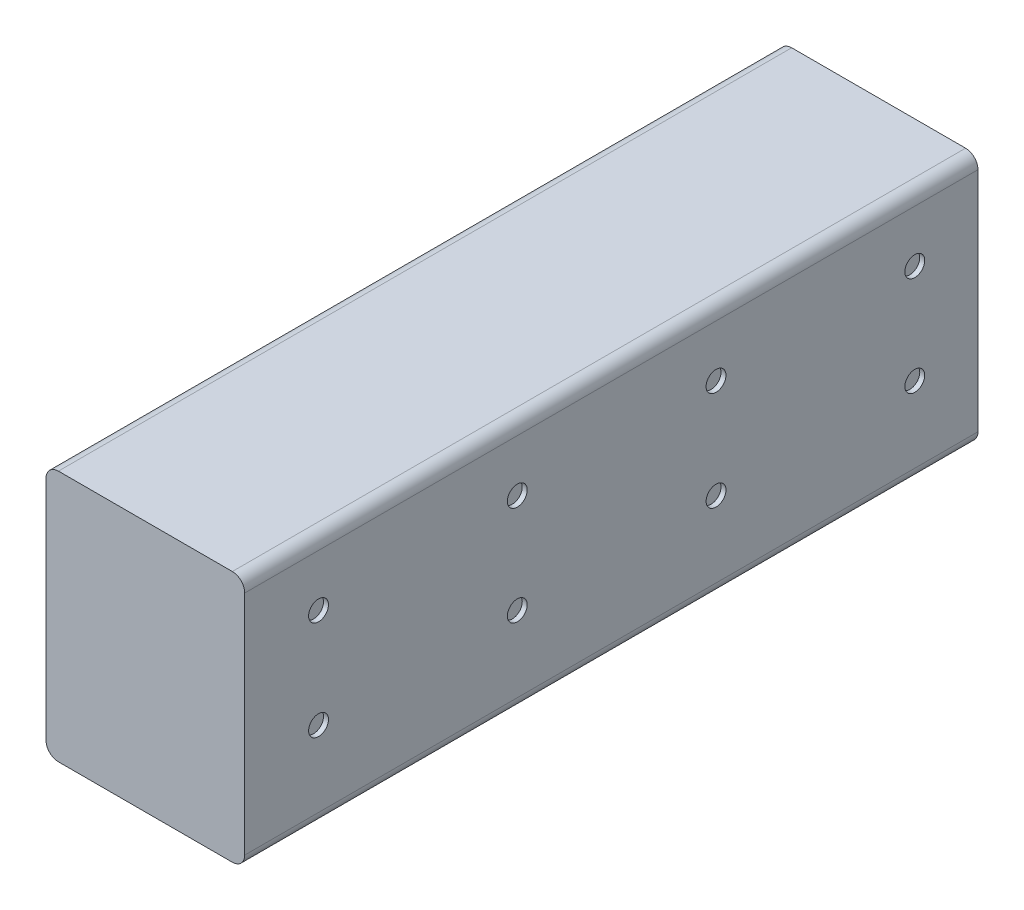
ISO-10303-21;
HEADER;
FILE_DESCRIPTION(('STEP AP214'),'2;1');
FILE_NAME('part.step','',(''),(''),'','','');
FILE_SCHEMA(('AUTOMOTIVE_DESIGN { 1 0 10303 214 1 1 1 1 }'));
ENDSEC;
DATA;
#1=APPLICATION_CONTEXT('core data for automotive mechanical design processes');
#2=APPLICATION_PROTOCOL_DEFINITION('international standard','automotive_design',2000,#1);
#3=PRODUCT_CONTEXT('',#1,'mechanical');
#4=PRODUCT('Part','Part','',(#3));
#5=PRODUCT_RELATED_PRODUCT_CATEGORY('part','',(#4));
#6=PRODUCT_DEFINITION_FORMATION('','',#4);
#7=PRODUCT_DEFINITION_CONTEXT('part definition',#1,'design');
#8=PRODUCT_DEFINITION('design','',#6,#7);
#9=PRODUCT_DEFINITION_SHAPE('','',#8);
#10=(LENGTH_UNIT() NAMED_UNIT(*) SI_UNIT(.MILLI.,.METRE.));
#11=(NAMED_UNIT(*) PLANE_ANGLE_UNIT() SI_UNIT($,.RADIAN.));
#12=(NAMED_UNIT(*) SI_UNIT($,.STERADIAN.) SOLID_ANGLE_UNIT());
#13=UNCERTAINTY_MEASURE_WITH_UNIT(LENGTH_MEASURE(1.E-05),#10,'distance_accuracy_value','');
#14=(GEOMETRIC_REPRESENTATION_CONTEXT(3) GLOBAL_UNCERTAINTY_ASSIGNED_CONTEXT((#13)) GLOBAL_UNIT_ASSIGNED_CONTEXT((#10,
#11,#12)) REPRESENTATION_CONTEXT('',''));
#15=CARTESIAN_POINT('',(0.,0.,0.));
#16=DIRECTION('',(0.,0.,1.));
#17=DIRECTION('',(1.,0.,0.));
#18=AXIS2_PLACEMENT_3D('',#15,#16,#17);
#19=CARTESIAN_POINT('',(0.,0.,295.148));
#20=DIRECTION('',(1.,0.,0.));
#21=DIRECTION('',(0.,0.,-1.));
#22=AXIS2_PLACEMENT_3D('',#19,#20,#21);
#23=PLANE('',#22);
#24=CARTESIAN_POINT('',(0.,35.4507659315116,185.445597479447));
#25=DIRECTION('',(1.,0.,0.));
#26=DIRECTION('',(0.,0.,-1.));
#27=AXIS2_PLACEMENT_3D('',#24,#25,#26);
#28=CIRCLE('',#27,3.99999999999999);
#29=CARTESIAN_POINT('',(0.,35.4507659315116,181.445597479447));
#30=VERTEX_POINT('',#29);
#31=EDGE_CURVE('E281',#30,#30,#28,.T.);
#32=ORIENTED_EDGE('',*,*,#31,.T.);
#33=EDGE_LOOP('',(#32));
#34=FACE_BOUND('',#33,.T.);
#35=CARTESIAN_POINT('',(0.,75.4507659315116,25.4455974794472));
#36=DIRECTION('',(1.,0.,0.));
#37=DIRECTION('',(0.,0.,-1.));
#38=AXIS2_PLACEMENT_3D('',#35,#36,#37);
#39=CIRCLE('',#38,3.99999999999999);
#40=CARTESIAN_POINT('',(0.,75.4507659315116,21.4455974794472));
#41=VERTEX_POINT('',#40);
#42=EDGE_CURVE('E290',#41,#41,#39,.T.);
#43=ORIENTED_EDGE('',*,*,#42,.T.);
#44=EDGE_LOOP('',(#43));
#45=FACE_BOUND('',#44,.T.);
#46=CARTESIAN_POINT('',(0.,75.4507659315116,105.445597479447));
#47=DIRECTION('',(1.,0.,0.));
#48=DIRECTION('',(0.,0.,-1.));
#49=AXIS2_PLACEMENT_3D('',#46,#47,#48);
#50=CIRCLE('',#49,3.99999999999999);
#51=CARTESIAN_POINT('',(0.,75.4507659315116,101.445597479447));
#52=VERTEX_POINT('',#51);
#53=EDGE_CURVE('E265',#52,#52,#50,.T.);
#54=ORIENTED_EDGE('',*,*,#53,.T.);
#55=EDGE_LOOP('',(#54));
#56=FACE_BOUND('',#55,.T.);
#57=CARTESIAN_POINT('',(0.,75.4507659315116,185.445597479447));
#58=DIRECTION('',(1.,0.,0.));
#59=DIRECTION('',(0.,0.,-1.));
#60=AXIS2_PLACEMENT_3D('',#57,#58,#59);
#61=CIRCLE('',#60,3.99999999999999);
#62=CARTESIAN_POINT('',(0.,75.4507659315116,181.445597479447));
#63=VERTEX_POINT('',#62);
#64=EDGE_CURVE('E274',#63,#63,#61,.T.);
#65=ORIENTED_EDGE('',*,*,#64,.T.);
#66=EDGE_LOOP('',(#65));
#67=FACE_BOUND('',#66,.T.);
#68=CARTESIAN_POINT('',(0.,35.4507659315116,105.445597479447));
#69=DIRECTION('',(1.,0.,0.));
#70=DIRECTION('',(0.,0.,-1.));
#71=AXIS2_PLACEMENT_3D('',#68,#69,#70);
#72=CIRCLE('',#71,3.99999999999999);
#73=CARTESIAN_POINT('',(0.,35.4507659315116,101.445597479447));
#74=VERTEX_POINT('',#73);
#75=EDGE_CURVE('E313',#74,#74,#72,.T.);
#76=ORIENTED_EDGE('',*,*,#75,.T.);
#77=EDGE_LOOP('',(#76));
#78=FACE_BOUND('',#77,.T.);
#79=CARTESIAN_POINT('',(0.,35.4507659315116,25.4455974794468));
#80=DIRECTION('',(1.,0.,0.));
#81=DIRECTION('',(0.,0.,-1.));
#82=AXIS2_PLACEMENT_3D('',#79,#80,#81);
#83=CIRCLE('',#82,3.99999999999999);
#84=CARTESIAN_POINT('',(0.,35.4507659315116,21.4455974794468));
#85=VERTEX_POINT('',#84);
#86=EDGE_CURVE('E305',#85,#85,#83,.T.);
#87=ORIENTED_EDGE('',*,*,#86,.T.);
#88=EDGE_LOOP('',(#87));
#89=FACE_BOUND('',#88,.T.);
#90=CARTESIAN_POINT('',(0.,35.4507659315116,265.445597479447));
#91=DIRECTION('',(1.,0.,0.));
#92=DIRECTION('',(0.,0.,-1.));
#93=AXIS2_PLACEMENT_3D('',#90,#91,#92);
#94=CIRCLE('',#93,3.99999999999999);
#95=CARTESIAN_POINT('',(0.,35.4507659315116,261.445597479447));
#96=VERTEX_POINT('',#95);
#97=EDGE_CURVE('E297',#96,#96,#94,.T.);
#98=ORIENTED_EDGE('',*,*,#97,.T.);
#99=EDGE_LOOP('',(#98));
#100=FACE_BOUND('',#99,.T.);
#101=CARTESIAN_POINT('',(0.,75.4507659315116,265.445597479447));
#102=DIRECTION('',(1.,0.,0.));
#103=DIRECTION('',(0.,0.,-1.));
#104=AXIS2_PLACEMENT_3D('',#101,#102,#103);
#105=CIRCLE('',#104,3.99999999999999);
#106=CARTESIAN_POINT('',(0.,75.4507659315116,261.445597479447));
#107=VERTEX_POINT('',#106);
#108=EDGE_CURVE('E257',#107,#107,#105,.T.);
#109=ORIENTED_EDGE('',*,*,#108,.T.);
#110=EDGE_LOOP('',(#109));
#111=FACE_BOUND('',#110,.T.);
#112=DIRECTION('',(0.,-1.,0.));
#113=VECTOR('',#112,1.);
#114=CARTESIAN_POINT('',(0.,0.,0.));
#115=LINE('',#114,#113);
#116=CARTESIAN_POINT('',(0.,96.346,0.));
#117=VERTEX_POINT('',#116);
#118=CARTESIAN_POINT('',(0.,5.,0.));
#119=VERTEX_POINT('',#118);
#120=EDGE_CURVE('E120',#117,#119,#115,.T.);
#121=ORIENTED_EDGE('',*,*,#120,.T.);
#122=DIRECTION('',(0.,0.,-1.));
#123=VECTOR('',#122,1.);
#124=CARTESIAN_POINT('',(0.,5.,295.148));
#125=LINE('',#124,#123);
#126=CARTESIAN_POINT('',(0.,5.,295.148));
#127=VERTEX_POINT('',#126);
#128=EDGE_CURVE('E174',#119,#127,#125,.F.);
#129=ORIENTED_EDGE('',*,*,#128,.T.);
#130=DIRECTION('',(0.,-1.,0.));
#131=VECTOR('',#130,1.);
#132=CARTESIAN_POINT('',(0.,0.,295.148));
#133=LINE('',#132,#131);
#134=CARTESIAN_POINT('',(0.,96.346,295.148));
#135=VERTEX_POINT('',#134);
#136=EDGE_CURVE('E123',#135,#127,#133,.T.);
#137=ORIENTED_EDGE('',*,*,#136,.F.);
#138=DIRECTION('',(0.,0.,-1.));
#139=VECTOR('',#138,1.);
#140=CARTESIAN_POINT('',(0.,96.346,295.148));
#141=LINE('',#140,#139);
#142=EDGE_CURVE('E110',#135,#117,#141,.T.);
#143=ORIENTED_EDGE('',*,*,#142,.T.);
#144=EDGE_LOOP('',(#121,#129,#137,#143));
#145=FACE_BOUND('',#144,.T.);
#146=ADVANCED_FACE('F39',(#34,#45,#56,#67,#78,#89,#100,#111,#145),#23,.F.);
#147=CARTESIAN_POINT('',(0.,0.,295.148));
#148=DIRECTION('',(0.,1.,0.));
#149=DIRECTION('',(0.,0.,1.));
#150=AXIS2_PLACEMENT_3D('',#147,#148,#149);
#151=PLANE('',#150);
#152=DIRECTION('',(1.,0.,0.));
#153=VECTOR('',#152,1.);
#154=CARTESIAN_POINT('',(0.,0.,0.));
#155=LINE('',#154,#153);
#156=CARTESIAN_POINT('',(5.,0.,0.));
#157=VERTEX_POINT('',#156);
#158=CARTESIAN_POINT('',(75.,0.,0.));
#159=VERTEX_POINT('',#158);
#160=EDGE_CURVE('E130',#157,#159,#155,.T.);
#161=ORIENTED_EDGE('',*,*,#160,.T.);
#162=DIRECTION('',(0.,0.,-1.));
#163=VECTOR('',#162,1.);
#164=CARTESIAN_POINT('',(75.,0.,295.148));
#165=LINE('',#164,#163);
#166=CARTESIAN_POINT('',(75.,0.,295.148));
#167=VERTEX_POINT('',#166);
#168=EDGE_CURVE('E48',#159,#167,#165,.F.);
#169=ORIENTED_EDGE('',*,*,#168,.T.);
#170=DIRECTION('',(1.,0.,0.));
#171=VECTOR('',#170,1.);
#172=CARTESIAN_POINT('',(0.,0.,295.148));
#173=LINE('',#172,#171);
#174=CARTESIAN_POINT('',(5.,0.,295.148));
#175=VERTEX_POINT('',#174);
#176=EDGE_CURVE('E190',#175,#167,#173,.T.);
#177=ORIENTED_EDGE('',*,*,#176,.F.);
#178=DIRECTION('',(0.,0.,-1.));
#179=VECTOR('',#178,1.);
#180=CARTESIAN_POINT('',(5.,0.,295.148));
#181=LINE('',#180,#179);
#182=EDGE_CURVE('E168',#175,#157,#181,.T.);
#183=ORIENTED_EDGE('',*,*,#182,.T.);
#184=EDGE_LOOP('',(#161,#169,#177,#183));
#185=FACE_BOUND('',#184,.T.);
#186=ADVANCED_FACE('F338',(#185),#151,.F.);
#187=CARTESIAN_POINT('',(80.,0.,295.148));
#188=DIRECTION('',(-1.,0.,0.));
#189=DIRECTION('',(0.,0.,1.));
#190=AXIS2_PLACEMENT_3D('',#187,#188,#189);
#191=PLANE('',#190);
#192=CARTESIAN_POINT('',(80.,35.4507659315116,185.445597479447));
#193=DIRECTION('',(1.,0.,0.));
#194=DIRECTION('',(0.,0.,-1.));
#195=AXIS2_PLACEMENT_3D('',#192,#193,#194);
#196=CIRCLE('',#195,3.99999999999999);
#197=CARTESIAN_POINT('',(80.,35.4507659315116,181.445597479447));
#198=VERTEX_POINT('',#197);
#199=EDGE_CURVE('E217',#198,#198,#196,.T.);
#200=ORIENTED_EDGE('',*,*,#199,.F.);
#201=EDGE_LOOP('',(#200));
#202=FACE_BOUND('',#201,.T.);
#203=CARTESIAN_POINT('',(80.,75.4507659315116,25.4455974794472));
#204=DIRECTION('',(1.,0.,0.));
#205=DIRECTION('',(0.,0.,-1.));
#206=AXIS2_PLACEMENT_3D('',#203,#204,#205);
#207=CIRCLE('',#206,3.99999999999999);
#208=CARTESIAN_POINT('',(80.,75.4507659315116,21.4455974794472));
#209=VERTEX_POINT('',#208);
#210=EDGE_CURVE('E226',#209,#209,#207,.T.);
#211=ORIENTED_EDGE('',*,*,#210,.F.);
#212=EDGE_LOOP('',(#211));
#213=FACE_BOUND('',#212,.T.);
#214=CARTESIAN_POINT('',(80.,75.4507659315116,105.445597479447));
#215=DIRECTION('',(1.,0.,0.));
#216=DIRECTION('',(0.,0.,-1.));
#217=AXIS2_PLACEMENT_3D('',#214,#215,#216);
#218=CIRCLE('',#217,3.99999999999999);
#219=CARTESIAN_POINT('',(80.,75.4507659315116,101.445597479447));
#220=VERTEX_POINT('',#219);
#221=EDGE_CURVE('E201',#220,#220,#218,.T.);
#222=ORIENTED_EDGE('',*,*,#221,.F.);
#223=EDGE_LOOP('',(#222));
#224=FACE_BOUND('',#223,.T.);
#225=CARTESIAN_POINT('',(80.,75.4507659315116,185.445597479447));
#226=DIRECTION('',(1.,0.,0.));
#227=DIRECTION('',(0.,0.,-1.));
#228=AXIS2_PLACEMENT_3D('',#225,#226,#227);
#229=CIRCLE('',#228,3.99999999999999);
#230=CARTESIAN_POINT('',(80.,75.4507659315116,181.445597479447));
#231=VERTEX_POINT('',#230);
#232=EDGE_CURVE('E210',#231,#231,#229,.T.);
#233=ORIENTED_EDGE('',*,*,#232,.F.);
#234=EDGE_LOOP('',(#233));
#235=FACE_BOUND('',#234,.T.);
#236=CARTESIAN_POINT('',(80.,35.4507659315116,105.445597479447));
#237=DIRECTION('',(1.,0.,0.));
#238=DIRECTION('',(0.,0.,-1.));
#239=AXIS2_PLACEMENT_3D('',#236,#237,#238);
#240=CIRCLE('',#239,3.99999999999999);
#241=CARTESIAN_POINT('',(80.,35.4507659315116,101.445597479447));
#242=VERTEX_POINT('',#241);
#243=EDGE_CURVE('E250',#242,#242,#240,.T.);
#244=ORIENTED_EDGE('',*,*,#243,.F.);
#245=EDGE_LOOP('',(#244));
#246=FACE_BOUND('',#245,.T.);
#247=CARTESIAN_POINT('',(80.,35.4507659315116,25.4455974794468));
#248=DIRECTION('',(1.,0.,0.));
#249=DIRECTION('',(0.,0.,-1.));
#250=AXIS2_PLACEMENT_3D('',#247,#248,#249);
#251=CIRCLE('',#250,3.99999999999999);
#252=CARTESIAN_POINT('',(80.,35.4507659315116,21.4455974794468));
#253=VERTEX_POINT('',#252);
#254=EDGE_CURVE('E242',#253,#253,#251,.T.);
#255=ORIENTED_EDGE('',*,*,#254,.F.);
#256=EDGE_LOOP('',(#255));
#257=FACE_BOUND('',#256,.T.);
#258=CARTESIAN_POINT('',(80.,35.4507659315116,265.445597479447));
#259=DIRECTION('',(1.,0.,0.));
#260=DIRECTION('',(0.,0.,-1.));
#261=AXIS2_PLACEMENT_3D('',#258,#259,#260);
#262=CIRCLE('',#261,3.99999999999999);
#263=CARTESIAN_POINT('',(80.,35.4507659315116,261.445597479447));
#264=VERTEX_POINT('',#263);
#265=EDGE_CURVE('E233',#264,#264,#262,.T.);
#266=ORIENTED_EDGE('',*,*,#265,.F.);
#267=EDGE_LOOP('',(#266));
#268=FACE_BOUND('',#267,.T.);
#269=CARTESIAN_POINT('',(80.,75.4507659315116,265.445597479447));
#270=DIRECTION('',(1.,0.,0.));
#271=DIRECTION('',(0.,0.,-1.));
#272=AXIS2_PLACEMENT_3D('',#269,#270,#271);
#273=CIRCLE('',#272,3.99999999999999);
#274=CARTESIAN_POINT('',(80.,75.4507659315116,261.445597479447));
#275=VERTEX_POINT('',#274);
#276=EDGE_CURVE('E138',#275,#275,#273,.T.);
#277=ORIENTED_EDGE('',*,*,#276,.F.);
#278=EDGE_LOOP('',(#277));
#279=FACE_BOUND('',#278,.T.);
#280=DIRECTION('',(0.,1.,0.));
#281=VECTOR('',#280,1.);
#282=CARTESIAN_POINT('',(80.,0.,295.148));
#283=LINE('',#282,#281);
#284=CARTESIAN_POINT('',(80.,5.,295.148));
#285=VERTEX_POINT('',#284);
#286=CARTESIAN_POINT('',(80.,96.346,295.148));
#287=VERTEX_POINT('',#286);
#288=EDGE_CURVE('E188',#285,#287,#283,.T.);
#289=ORIENTED_EDGE('',*,*,#288,.F.);
#290=DIRECTION('',(0.,0.,-1.));
#291=VECTOR('',#290,1.);
#292=CARTESIAN_POINT('',(80.,5.,295.148));
#293=LINE('',#292,#291);
#294=CARTESIAN_POINT('',(80.,5.,0.));
#295=VERTEX_POINT('',#294);
#296=EDGE_CURVE('E180',#285,#295,#293,.T.);
#297=ORIENTED_EDGE('',*,*,#296,.T.);
#298=DIRECTION('',(0.,1.,0.));
#299=VECTOR('',#298,1.);
#300=CARTESIAN_POINT('',(80.,0.,0.));
#301=LINE('',#300,#299);
#302=CARTESIAN_POINT('',(80.,96.346,0.));
#303=VERTEX_POINT('',#302);
#304=EDGE_CURVE('E135',#295,#303,#301,.T.);
#305=ORIENTED_EDGE('',*,*,#304,.T.);
#306=DIRECTION('',(0.,0.,-1.));
#307=VECTOR('',#306,1.);
#308=CARTESIAN_POINT('',(80.,96.346,295.148));
#309=LINE('',#308,#307);
#310=EDGE_CURVE('E161',#303,#287,#309,.F.);
#311=ORIENTED_EDGE('',*,*,#310,.T.);
#312=EDGE_LOOP('',(#289,#297,#305,#311));
#313=FACE_BOUND('',#312,.T.);
#314=ADVANCED_FACE('F344',(#202,#213,#224,#235,#246,#257,#268,#279,#313),#191,.F.);
#315=CARTESIAN_POINT('',(0.,101.346,295.148));
#316=DIRECTION('',(0.,-1.,0.));
#317=DIRECTION('',(0.,0.,-1.));
#318=AXIS2_PLACEMENT_3D('',#315,#316,#317);
#319=PLANE('',#318);
#320=DIRECTION('',(-1.,0.,0.));
#321=VECTOR('',#320,1.);
#322=CARTESIAN_POINT('',(0.,101.346,295.148));
#323=LINE('',#322,#321);
#324=CARTESIAN_POINT('',(75.,101.346,295.148));
#325=VERTEX_POINT('',#324);
#326=CARTESIAN_POINT('',(5.,101.346,295.148));
#327=VERTEX_POINT('',#326);
#328=EDGE_CURVE('E125',#325,#327,#323,.T.);
#329=ORIENTED_EDGE('',*,*,#328,.F.);
#330=DIRECTION('',(0.,0.,-1.));
#331=VECTOR('',#330,1.);
#332=CARTESIAN_POINT('',(75.,101.346,295.148));
#333=LINE('',#332,#331);
#334=CARTESIAN_POINT('',(75.,101.346,0.));
#335=VERTEX_POINT('',#334);
#336=EDGE_CURVE('E153',#325,#335,#333,.T.);
#337=ORIENTED_EDGE('',*,*,#336,.T.);
#338=DIRECTION('',(-1.,0.,0.));
#339=VECTOR('',#338,1.);
#340=CARTESIAN_POINT('',(0.,101.346,0.));
#341=LINE('',#340,#339);
#342=CARTESIAN_POINT('',(5.,101.346,0.));
#343=VERTEX_POINT('',#342);
#344=EDGE_CURVE('E145',#335,#343,#341,.T.);
#345=ORIENTED_EDGE('',*,*,#344,.T.);
#346=DIRECTION('',(0.,0.,-1.));
#347=VECTOR('',#346,1.);
#348=CARTESIAN_POINT('',(5.,101.346,295.148));
#349=LINE('',#348,#347);
#350=EDGE_CURVE('E112',#343,#327,#349,.F.);
#351=ORIENTED_EDGE('',*,*,#350,.T.);
#352=EDGE_LOOP('',(#329,#337,#345,#351));
#353=FACE_BOUND('',#352,.T.);
#354=ADVANCED_FACE('F373',(#353),#319,.F.);
#355=CARTESIAN_POINT('',(0.,0.,295.148));
#356=DIRECTION('',(0.,0.,-1.));
#357=DIRECTION('',(-1.,0.,0.));
#358=AXIS2_PLACEMENT_3D('',#355,#356,#357);
#359=PLANE('',#358);
#360=ORIENTED_EDGE('',*,*,#176,.T.);
#361=CARTESIAN_POINT('',(75.,5.,295.148));
#362=DIRECTION('',(0.,0.,-1.));
#363=DIRECTION('',(-1.,0.,0.));
#364=AXIS2_PLACEMENT_3D('',#361,#362,#363);
#365=CIRCLE('',#364,5.);
#366=EDGE_CURVE('E11',#167,#285,#365,.F.);
#367=ORIENTED_EDGE('',*,*,#366,.T.);
#368=ORIENTED_EDGE('',*,*,#288,.T.);
#369=CARTESIAN_POINT('',(75.,96.346,295.148));
#370=DIRECTION('',(0.,0.,-1.));
#371=DIRECTION('',(-1.,0.,0.));
#372=AXIS2_PLACEMENT_3D('',#369,#370,#371);
#373=CIRCLE('',#372,5.);
#374=EDGE_CURVE('E165',#287,#325,#373,.F.);
#375=ORIENTED_EDGE('',*,*,#374,.T.);
#376=ORIENTED_EDGE('',*,*,#328,.T.);
#377=CARTESIAN_POINT('',(5.,96.346,295.148));
#378=DIRECTION('',(0.,0.,-1.));
#379=DIRECTION('',(-1.,0.,0.));
#380=AXIS2_PLACEMENT_3D('',#377,#378,#379);
#381=CIRCLE('',#380,5.);
#382=EDGE_CURVE('E150',#327,#135,#381,.F.);
#383=ORIENTED_EDGE('',*,*,#382,.T.);
#384=ORIENTED_EDGE('',*,*,#136,.T.);
#385=CARTESIAN_POINT('',(5.,5.,295.148));
#386=DIRECTION('',(0.,0.,-1.));
#387=DIRECTION('',(-1.,0.,0.));
#388=AXIS2_PLACEMENT_3D('',#385,#386,#387);
#389=CIRCLE('',#388,5.);
#390=EDGE_CURVE('E177',#127,#175,#389,.F.);
#391=ORIENTED_EDGE('',*,*,#390,.T.);
#392=EDGE_LOOP('',(#360,#367,#368,#375,#376,#383,#384,#391));
#393=FACE_BOUND('',#392,.T.);
#394=ADVANCED_FACE('F363',(#393),#359,.F.);
#395=CARTESIAN_POINT('',(0.,0.,0.));
#396=DIRECTION('',(0.,0.,-1.));
#397=DIRECTION('',(-1.,0.,0.));
#398=AXIS2_PLACEMENT_3D('',#395,#396,#397);
#399=PLANE('',#398);
#400=ORIENTED_EDGE('',*,*,#304,.F.);
#401=CARTESIAN_POINT('',(75.,5.,0.));
#402=DIRECTION('',(0.,0.,-1.));
#403=DIRECTION('',(-1.,0.,0.));
#404=AXIS2_PLACEMENT_3D('',#401,#402,#403);
#405=CIRCLE('',#404,5.);
#406=EDGE_CURVE('E62',#295,#159,#405,.T.);
#407=ORIENTED_EDGE('',*,*,#406,.T.);
#408=ORIENTED_EDGE('',*,*,#160,.F.);
#409=CARTESIAN_POINT('',(5.,5.,0.));
#410=DIRECTION('',(0.,0.,-1.));
#411=DIRECTION('',(-1.,0.,0.));
#412=AXIS2_PLACEMENT_3D('',#409,#410,#411);
#413=CIRCLE('',#412,5.);
#414=EDGE_CURVE('E128',#157,#119,#413,.T.);
#415=ORIENTED_EDGE('',*,*,#414,.T.);
#416=ORIENTED_EDGE('',*,*,#120,.F.);
#417=CARTESIAN_POINT('',(5.,96.346,0.));
#418=DIRECTION('',(0.,0.,-1.));
#419=DIRECTION('',(-1.,0.,0.));
#420=AXIS2_PLACEMENT_3D('',#417,#418,#419);
#421=CIRCLE('',#420,5.);
#422=EDGE_CURVE('E106',#117,#343,#421,.T.);
#423=ORIENTED_EDGE('',*,*,#422,.T.);
#424=ORIENTED_EDGE('',*,*,#344,.F.);
#425=CARTESIAN_POINT('',(75.,96.346,0.));
#426=DIRECTION('',(0.,0.,-1.));
#427=DIRECTION('',(-1.,0.,0.));
#428=AXIS2_PLACEMENT_3D('',#425,#426,#427);
#429=CIRCLE('',#428,5.);
#430=EDGE_CURVE('E157',#335,#303,#429,.T.);
#431=ORIENTED_EDGE('',*,*,#430,.T.);
#432=EDGE_LOOP('',(#400,#407,#408,#415,#416,#423,#424,#431));
#433=FACE_BOUND('',#432,.T.);
#434=ADVANCED_FACE('F127',(#433),#399,.T.);
#435=CARTESIAN_POINT('',(78.,75.4507659315116,265.445597479447));
#436=DIRECTION('',(1.,0.,0.));
#437=DIRECTION('',(0.,0.,-1.));
#438=AXIS2_PLACEMENT_3D('',#435,#436,#437);
#439=CYLINDRICAL_SURFACE('',#438,3.99999999999999);
#440=CARTESIAN_POINT('',(78.,75.4507659315116,265.445597479447));
#441=DIRECTION('',(1.,0.,0.));
#442=DIRECTION('',(0.,0.,-1.));
#443=AXIS2_PLACEMENT_3D('',#440,#441,#442);
#444=CIRCLE('',#443,3.99999999999999);
#445=CARTESIAN_POINT('',(78.,75.4507659315116,261.445597479447));
#446=VERTEX_POINT('',#445);
#447=EDGE_CURVE('E131',#446,#446,#444,.T.);
#448=ORIENTED_EDGE('',*,*,#447,.F.);
#449=EDGE_LOOP('',(#448));
#450=FACE_BOUND('',#449,.T.);
#451=ORIENTED_EDGE('',*,*,#276,.T.);
#452=EDGE_LOOP('',(#451));
#453=FACE_BOUND('',#452,.T.);
#454=ADVANCED_FACE('F384',(#450,#453),#439,.F.);
#455=CARTESIAN_POINT('',(78.,75.4507659315116,265.445597479447));
#456=DIRECTION('',(1.,0.,0.));
#457=DIRECTION('',(0.,0.,-1.));
#458=AXIS2_PLACEMENT_3D('',#455,#456,#457);
#459=PLANE('',#458);
#460=ORIENTED_EDGE('',*,*,#447,.T.);
#461=EDGE_LOOP('',(#460));
#462=FACE_BOUND('',#461,.T.);
#463=ADVANCED_FACE('F388',(#462),#459,.T.);
#464=CARTESIAN_POINT('',(78.,35.4507659315116,265.445597479447));
#465=DIRECTION('',(1.,0.,0.));
#466=DIRECTION('',(0.,0.,-1.));
#467=AXIS2_PLACEMENT_3D('',#464,#465,#466);
#468=CYLINDRICAL_SURFACE('',#467,3.99999999999999);
#469=CARTESIAN_POINT('',(78.,35.4507659315116,265.445597479447));
#470=DIRECTION('',(1.,0.,0.));
#471=DIRECTION('',(0.,0.,-1.));
#472=AXIS2_PLACEMENT_3D('',#469,#470,#471);
#473=CIRCLE('',#472,3.99999999999999);
#474=CARTESIAN_POINT('',(78.,35.4507659315116,261.445597479447));
#475=VERTEX_POINT('',#474);
#476=EDGE_CURVE('E237',#475,#475,#473,.T.);
#477=ORIENTED_EDGE('',*,*,#476,.F.);
#478=EDGE_LOOP('',(#477));
#479=FACE_BOUND('',#478,.T.);
#480=ORIENTED_EDGE('',*,*,#265,.T.);
#481=EDGE_LOOP('',(#480));
#482=FACE_BOUND('',#481,.T.);
#483=ADVANCED_FACE('F392',(#479,#482),#468,.F.);
#484=CARTESIAN_POINT('',(78.,35.4507659315116,265.445597479447));
#485=DIRECTION('',(1.,0.,0.));
#486=DIRECTION('',(0.,0.,-1.));
#487=AXIS2_PLACEMENT_3D('',#484,#485,#486);
#488=PLANE('',#487);
#489=ORIENTED_EDGE('',*,*,#476,.T.);
#490=EDGE_LOOP('',(#489));
#491=FACE_BOUND('',#490,.T.);
#492=ADVANCED_FACE('F430',(#491),#488,.T.);
#493=CARTESIAN_POINT('',(78.,35.4507659315116,25.4455974794468));
#494=DIRECTION('',(1.,0.,0.));
#495=DIRECTION('',(0.,0.,-1.));
#496=AXIS2_PLACEMENT_3D('',#493,#494,#495);
#497=CYLINDRICAL_SURFACE('',#496,3.99999999999999);
#498=CARTESIAN_POINT('',(78.,35.4507659315116,25.4455974794468));
#499=DIRECTION('',(1.,0.,0.));
#500=DIRECTION('',(0.,0.,-1.));
#501=AXIS2_PLACEMENT_3D('',#498,#499,#500);
#502=CIRCLE('',#501,3.99999999999999);
#503=CARTESIAN_POINT('',(78.,35.4507659315116,21.4455974794468));
#504=VERTEX_POINT('',#503);
#505=EDGE_CURVE('E246',#504,#504,#502,.T.);
#506=ORIENTED_EDGE('',*,*,#505,.F.);
#507=EDGE_LOOP('',(#506));
#508=FACE_BOUND('',#507,.T.);
#509=ORIENTED_EDGE('',*,*,#254,.T.);
#510=EDGE_LOOP('',(#509));
#511=FACE_BOUND('',#510,.T.);
#512=ADVANCED_FACE('F434',(#508,#511),#497,.F.);
#513=CARTESIAN_POINT('',(78.,35.4507659315116,25.4455974794468));
#514=DIRECTION('',(1.,0.,0.));
#515=DIRECTION('',(0.,0.,-1.));
#516=AXIS2_PLACEMENT_3D('',#513,#514,#515);
#517=PLANE('',#516);
#518=ORIENTED_EDGE('',*,*,#505,.T.);
#519=EDGE_LOOP('',(#518));
#520=FACE_BOUND('',#519,.T.);
#521=ADVANCED_FACE('F438',(#520),#517,.T.);
#522=CARTESIAN_POINT('',(78.,35.4507659315116,105.445597479447));
#523=DIRECTION('',(1.,0.,0.));
#524=DIRECTION('',(0.,0.,-1.));
#525=AXIS2_PLACEMENT_3D('',#522,#523,#524);
#526=CYLINDRICAL_SURFACE('',#525,3.99999999999999);
#527=CARTESIAN_POINT('',(78.,35.4507659315116,105.445597479447));
#528=DIRECTION('',(1.,0.,0.));
#529=DIRECTION('',(0.,0.,-1.));
#530=AXIS2_PLACEMENT_3D('',#527,#528,#529);
#531=CIRCLE('',#530,3.99999999999999);
#532=CARTESIAN_POINT('',(78.,35.4507659315116,101.445597479447));
#533=VERTEX_POINT('',#532);
#534=EDGE_CURVE('E222',#533,#533,#531,.T.);
#535=ORIENTED_EDGE('',*,*,#534,.F.);
#536=EDGE_LOOP('',(#535));
#537=FACE_BOUND('',#536,.T.);
#538=ORIENTED_EDGE('',*,*,#243,.T.);
#539=EDGE_LOOP('',(#538));
#540=FACE_BOUND('',#539,.T.);
#541=ADVANCED_FACE('F442',(#537,#540),#526,.F.);
#542=CARTESIAN_POINT('',(78.,35.4507659315116,105.445597479447));
#543=DIRECTION('',(1.,0.,0.));
#544=DIRECTION('',(0.,0.,-1.));
#545=AXIS2_PLACEMENT_3D('',#542,#543,#544);
#546=PLANE('',#545);
#547=ORIENTED_EDGE('',*,*,#534,.T.);
#548=EDGE_LOOP('',(#547));
#549=FACE_BOUND('',#548,.T.);
#550=ADVANCED_FACE('F407',(#549),#546,.T.);
#551=CARTESIAN_POINT('',(78.,75.4507659315116,185.445597479447));
#552=DIRECTION('',(1.,0.,0.));
#553=DIRECTION('',(0.,0.,-1.));
#554=AXIS2_PLACEMENT_3D('',#551,#552,#553);
#555=CYLINDRICAL_SURFACE('',#554,3.99999999999999);
#556=CARTESIAN_POINT('',(78.,75.4507659315116,185.445597479447));
#557=DIRECTION('',(1.,0.,0.));
#558=DIRECTION('',(0.,0.,-1.));
#559=AXIS2_PLACEMENT_3D('',#556,#557,#558);
#560=CIRCLE('',#559,3.99999999999999);
#561=CARTESIAN_POINT('',(78.,75.4507659315116,181.445597479447));
#562=VERTEX_POINT('',#561);
#563=EDGE_CURVE('E199',#562,#562,#560,.T.);
#564=ORIENTED_EDGE('',*,*,#563,.F.);
#565=EDGE_LOOP('',(#564));
#566=FACE_BOUND('',#565,.T.);
#567=ORIENTED_EDGE('',*,*,#232,.T.);
#568=EDGE_LOOP('',(#567));
#569=FACE_BOUND('',#568,.T.);
#570=ADVANCED_FACE('F404',(#566,#569),#555,.F.);
#571=CARTESIAN_POINT('',(78.,75.4507659315116,185.445597479447));
#572=DIRECTION('',(1.,0.,0.));
#573=DIRECTION('',(0.,0.,-1.));
#574=AXIS2_PLACEMENT_3D('',#571,#572,#573);
#575=PLANE('',#574);
#576=ORIENTED_EDGE('',*,*,#563,.T.);
#577=EDGE_LOOP('',(#576));
#578=FACE_BOUND('',#577,.T.);
#579=ADVANCED_FACE('F398',(#578),#575,.T.);
#580=CARTESIAN_POINT('',(78.,75.4507659315116,105.445597479447));
#581=DIRECTION('',(1.,0.,0.));
#582=DIRECTION('',(0.,0.,-1.));
#583=AXIS2_PLACEMENT_3D('',#580,#581,#582);
#584=CYLINDRICAL_SURFACE('',#583,3.99999999999999);
#585=CARTESIAN_POINT('',(78.,75.4507659315116,105.445597479447));
#586=DIRECTION('',(1.,0.,0.));
#587=DIRECTION('',(0.,0.,-1.));
#588=AXIS2_PLACEMENT_3D('',#585,#586,#587);
#589=CIRCLE('',#588,3.99999999999999);
#590=CARTESIAN_POINT('',(78.,75.4507659315116,101.445597479447));
#591=VERTEX_POINT('',#590);
#592=EDGE_CURVE('E205',#591,#591,#589,.T.);
#593=ORIENTED_EDGE('',*,*,#592,.F.);
#594=EDGE_LOOP('',(#593));
#595=FACE_BOUND('',#594,.T.);
#596=ORIENTED_EDGE('',*,*,#221,.T.);
#597=EDGE_LOOP('',(#596));
#598=FACE_BOUND('',#597,.T.);
#599=ADVANCED_FACE('F394',(#595,#598),#584,.F.);
#600=CARTESIAN_POINT('',(78.,75.4507659315116,105.445597479447));
#601=DIRECTION('',(1.,0.,0.));
#602=DIRECTION('',(0.,0.,-1.));
#603=AXIS2_PLACEMENT_3D('',#600,#601,#602);
#604=PLANE('',#603);
#605=ORIENTED_EDGE('',*,*,#592,.T.);
#606=EDGE_LOOP('',(#605));
#607=FACE_BOUND('',#606,.T.);
#608=ADVANCED_FACE('F397',(#607),#604,.T.);
#609=CARTESIAN_POINT('',(78.,75.4507659315116,25.4455974794472));
#610=DIRECTION('',(1.,0.,0.));
#611=DIRECTION('',(0.,0.,-1.));
#612=AXIS2_PLACEMENT_3D('',#609,#610,#611);
#613=CYLINDRICAL_SURFACE('',#612,3.99999999999999);
#614=CARTESIAN_POINT('',(78.,75.4507659315116,25.4455974794472));
#615=DIRECTION('',(1.,0.,0.));
#616=DIRECTION('',(0.,0.,-1.));
#617=AXIS2_PLACEMENT_3D('',#614,#615,#616);
#618=CIRCLE('',#617,3.99999999999999);
#619=CARTESIAN_POINT('',(78.,75.4507659315116,21.4455974794472));
#620=VERTEX_POINT('',#619);
#621=EDGE_CURVE('E206',#620,#620,#618,.T.);
#622=ORIENTED_EDGE('',*,*,#621,.F.);
#623=EDGE_LOOP('',(#622));
#624=FACE_BOUND('',#623,.T.);
#625=ORIENTED_EDGE('',*,*,#210,.T.);
#626=EDGE_LOOP('',(#625));
#627=FACE_BOUND('',#626,.T.);
#628=ADVANCED_FACE('F402',(#624,#627),#613,.F.);
#629=CARTESIAN_POINT('',(78.,75.4507659315116,25.4455974794472));
#630=DIRECTION('',(1.,0.,0.));
#631=DIRECTION('',(0.,0.,-1.));
#632=AXIS2_PLACEMENT_3D('',#629,#630,#631);
#633=PLANE('',#632);
#634=ORIENTED_EDGE('',*,*,#621,.T.);
#635=EDGE_LOOP('',(#634));
#636=FACE_BOUND('',#635,.T.);
#637=ADVANCED_FACE('F416',(#636),#633,.T.);
#638=CARTESIAN_POINT('',(78.,35.4507659315116,185.445597479447));
#639=DIRECTION('',(1.,0.,0.));
#640=DIRECTION('',(0.,0.,-1.));
#641=AXIS2_PLACEMENT_3D('',#638,#639,#640);
#642=CYLINDRICAL_SURFACE('',#641,3.99999999999999);
#643=CARTESIAN_POINT('',(78.,35.4507659315116,185.445597479447));
#644=DIRECTION('',(1.,0.,0.));
#645=DIRECTION('',(0.,0.,-1.));
#646=AXIS2_PLACEMENT_3D('',#643,#644,#645);
#647=CIRCLE('',#646,3.99999999999999);
#648=CARTESIAN_POINT('',(78.,35.4507659315116,181.445597479447));
#649=VERTEX_POINT('',#648);
#650=EDGE_CURVE('E221',#649,#649,#647,.T.);
#651=ORIENTED_EDGE('',*,*,#650,.F.);
#652=EDGE_LOOP('',(#651));
#653=FACE_BOUND('',#652,.T.);
#654=ORIENTED_EDGE('',*,*,#199,.T.);
#655=EDGE_LOOP('',(#654));
#656=FACE_BOUND('',#655,.T.);
#657=ADVANCED_FACE('F412',(#653,#656),#642,.F.);
#658=CARTESIAN_POINT('',(78.,35.4507659315116,185.445597479447));
#659=DIRECTION('',(1.,0.,0.));
#660=DIRECTION('',(0.,0.,-1.));
#661=AXIS2_PLACEMENT_3D('',#658,#659,#660);
#662=PLANE('',#661);
#663=ORIENTED_EDGE('',*,*,#650,.T.);
#664=EDGE_LOOP('',(#663));
#665=FACE_BOUND('',#664,.T.);
#666=ADVANCED_FACE('F415',(#665),#662,.T.);
#667=CARTESIAN_POINT('',(2.,75.4507659315116,265.445597479447));
#668=DIRECTION('',(-1.,0.,0.));
#669=DIRECTION('',(0.,0.,1.));
#670=AXIS2_PLACEMENT_3D('',#667,#668,#669);
#671=CYLINDRICAL_SURFACE('',#670,3.99999999999999);
#672=CARTESIAN_POINT('',(2.,75.4507659315116,265.445597479447));
#673=DIRECTION('',(1.,0.,0.));
#674=DIRECTION('',(0.,0.,-1.));
#675=AXIS2_PLACEMENT_3D('',#672,#673,#674);
#676=CIRCLE('',#675,3.99999999999999);
#677=CARTESIAN_POINT('',(2.,75.4507659315116,261.445597479447));
#678=VERTEX_POINT('',#677);
#679=EDGE_CURVE('E238',#678,#678,#676,.T.);
#680=ORIENTED_EDGE('',*,*,#679,.T.);
#681=EDGE_LOOP('',(#680));
#682=FACE_BOUND('',#681,.T.);
#683=ORIENTED_EDGE('',*,*,#108,.F.);
#684=EDGE_LOOP('',(#683));
#685=FACE_BOUND('',#684,.T.);
#686=ADVANCED_FACE('F420',(#682,#685),#671,.F.);
#687=CARTESIAN_POINT('',(2.,75.4507659315116,265.445597479447));
#688=DIRECTION('',(-1.,0.,0.));
#689=DIRECTION('',(0.,0.,-1.));
#690=AXIS2_PLACEMENT_3D('',#687,#688,#689);
#691=PLANE('',#690);
#692=ORIENTED_EDGE('',*,*,#679,.F.);
#693=EDGE_LOOP('',(#692));
#694=FACE_BOUND('',#693,.T.);
#695=ADVANCED_FACE('F452',(#694),#691,.T.);
#696=CARTESIAN_POINT('',(2.,35.4507659315116,265.445597479447));
#697=DIRECTION('',(-1.,0.,0.));
#698=DIRECTION('',(0.,0.,1.));
#699=AXIS2_PLACEMENT_3D('',#696,#697,#698);
#700=CYLINDRICAL_SURFACE('',#699,3.99999999999999);
#701=CARTESIAN_POINT('',(2.,35.4507659315116,265.445597479447));
#702=DIRECTION('',(1.,0.,0.));
#703=DIRECTION('',(0.,0.,-1.));
#704=AXIS2_PLACEMENT_3D('',#701,#702,#703);
#705=CIRCLE('',#704,3.99999999999999);
#706=CARTESIAN_POINT('',(2.,35.4507659315116,261.445597479447));
#707=VERTEX_POINT('',#706);
#708=EDGE_CURVE('E301',#707,#707,#705,.T.);
#709=ORIENTED_EDGE('',*,*,#708,.T.);
#710=EDGE_LOOP('',(#709));
#711=FACE_BOUND('',#710,.T.);
#712=ORIENTED_EDGE('',*,*,#97,.F.);
#713=EDGE_LOOP('',(#712));
#714=FACE_BOUND('',#713,.T.);
#715=ADVANCED_FACE('F456',(#711,#714),#700,.F.);
#716=CARTESIAN_POINT('',(2.,35.4507659315116,265.445597479447));
#717=DIRECTION('',(-1.,0.,0.));
#718=DIRECTION('',(0.,0.,-1.));
#719=AXIS2_PLACEMENT_3D('',#716,#717,#718);
#720=PLANE('',#719);
#721=ORIENTED_EDGE('',*,*,#708,.F.);
#722=EDGE_LOOP('',(#721));
#723=FACE_BOUND('',#722,.T.);
#724=ADVANCED_FACE('F486',(#723),#720,.T.);
#725=CARTESIAN_POINT('',(2.,35.4507659315116,25.4455974794468));
#726=DIRECTION('',(-1.,0.,0.));
#727=DIRECTION('',(0.,0.,1.));
#728=AXIS2_PLACEMENT_3D('',#725,#726,#727);
#729=CYLINDRICAL_SURFACE('',#728,3.99999999999999);
#730=CARTESIAN_POINT('',(2.,35.4507659315116,25.4455974794468));
#731=DIRECTION('',(1.,0.,0.));
#732=DIRECTION('',(0.,0.,-1.));
#733=AXIS2_PLACEMENT_3D('',#730,#731,#732);
#734=CIRCLE('',#733,3.99999999999999);
#735=CARTESIAN_POINT('',(2.,35.4507659315116,21.4455974794468));
#736=VERTEX_POINT('',#735);
#737=EDGE_CURVE('E309',#736,#736,#734,.T.);
#738=ORIENTED_EDGE('',*,*,#737,.T.);
#739=EDGE_LOOP('',(#738));
#740=FACE_BOUND('',#739,.T.);
#741=ORIENTED_EDGE('',*,*,#86,.F.);
#742=EDGE_LOOP('',(#741));
#743=FACE_BOUND('',#742,.T.);
#744=ADVANCED_FACE('F490',(#740,#743),#729,.F.);
#745=CARTESIAN_POINT('',(2.,35.4507659315116,25.4455974794468));
#746=DIRECTION('',(-1.,0.,0.));
#747=DIRECTION('',(0.,0.,-1.));
#748=AXIS2_PLACEMENT_3D('',#745,#746,#747);
#749=PLANE('',#748);
#750=ORIENTED_EDGE('',*,*,#737,.F.);
#751=EDGE_LOOP('',(#750));
#752=FACE_BOUND('',#751,.T.);
#753=ADVANCED_FACE('F335',(#752),#749,.T.);
#754=CARTESIAN_POINT('',(2.,35.4507659315116,105.445597479447));
#755=DIRECTION('',(-1.,0.,0.));
#756=DIRECTION('',(0.,0.,1.));
#757=AXIS2_PLACEMENT_3D('',#754,#755,#756);
#758=CYLINDRICAL_SURFACE('',#757,3.99999999999999);
#759=CARTESIAN_POINT('',(2.,35.4507659315116,105.445597479447));
#760=DIRECTION('',(1.,0.,0.));
#761=DIRECTION('',(0.,0.,-1.));
#762=AXIS2_PLACEMENT_3D('',#759,#760,#761);
#763=CIRCLE('',#762,3.99999999999999);
#764=CARTESIAN_POINT('',(2.,35.4507659315116,101.445597479447));
#765=VERTEX_POINT('',#764);
#766=EDGE_CURVE('E286',#765,#765,#763,.T.);
#767=ORIENTED_EDGE('',*,*,#766,.T.);
#768=EDGE_LOOP('',(#767));
#769=FACE_BOUND('',#768,.T.);
#770=ORIENTED_EDGE('',*,*,#75,.F.);
#771=EDGE_LOOP('',(#770));
#772=FACE_BOUND('',#771,.T.);
#773=ADVANCED_FACE('F321',(#769,#772),#758,.F.);
#774=CARTESIAN_POINT('',(2.,35.4507659315116,105.445597479447));
#775=DIRECTION('',(-1.,0.,0.));
#776=DIRECTION('',(0.,0.,-1.));
#777=AXIS2_PLACEMENT_3D('',#774,#775,#776);
#778=PLANE('',#777);
#779=ORIENTED_EDGE('',*,*,#766,.F.);
#780=EDGE_LOOP('',(#779));
#781=FACE_BOUND('',#780,.T.);
#782=ADVANCED_FACE('F324',(#781),#778,.T.);
#783=CARTESIAN_POINT('',(2.,75.4507659315116,185.445597479447));
#784=DIRECTION('',(-1.,0.,0.));
#785=DIRECTION('',(0.,0.,1.));
#786=AXIS2_PLACEMENT_3D('',#783,#784,#785);
#787=CYLINDRICAL_SURFACE('',#786,3.99999999999999);
#788=CARTESIAN_POINT('',(2.,75.4507659315116,185.445597479447));
#789=DIRECTION('',(1.,0.,0.));
#790=DIRECTION('',(0.,0.,-1.));
#791=AXIS2_PLACEMENT_3D('',#788,#789,#790);
#792=CIRCLE('',#791,3.99999999999999);
#793=CARTESIAN_POINT('',(2.,75.4507659315116,181.445597479447));
#794=VERTEX_POINT('',#793);
#795=EDGE_CURVE('E261',#794,#794,#792,.T.);
#796=ORIENTED_EDGE('',*,*,#795,.T.);
#797=EDGE_LOOP('',(#796));
#798=FACE_BOUND('',#797,.T.);
#799=ORIENTED_EDGE('',*,*,#64,.F.);
#800=EDGE_LOOP('',(#799));
#801=FACE_BOUND('',#800,.T.);
#802=ADVANCED_FACE('F326',(#798,#801),#787,.F.);
#803=CARTESIAN_POINT('',(2.,75.4507659315116,185.445597479447));
#804=DIRECTION('',(-1.,0.,0.));
#805=DIRECTION('',(0.,0.,-1.));
#806=AXIS2_PLACEMENT_3D('',#803,#804,#805);
#807=PLANE('',#806);
#808=ORIENTED_EDGE('',*,*,#795,.F.);
#809=EDGE_LOOP('',(#808));
#810=FACE_BOUND('',#809,.T.);
#811=ADVANCED_FACE('F332',(#810),#807,.T.);
#812=CARTESIAN_POINT('',(2.,75.4507659315116,105.445597479447));
#813=DIRECTION('',(-1.,0.,0.));
#814=DIRECTION('',(0.,0.,1.));
#815=AXIS2_PLACEMENT_3D('',#812,#813,#814);
#816=CYLINDRICAL_SURFACE('',#815,3.99999999999999);
#817=CARTESIAN_POINT('',(2.,75.4507659315116,105.445597479447));
#818=DIRECTION('',(1.,0.,0.));
#819=DIRECTION('',(0.,0.,-1.));
#820=AXIS2_PLACEMENT_3D('',#817,#818,#819);
#821=CIRCLE('',#820,3.99999999999999);
#822=CARTESIAN_POINT('',(2.,75.4507659315116,101.445597479447));
#823=VERTEX_POINT('',#822);
#824=EDGE_CURVE('E269',#823,#823,#821,.T.);
#825=ORIENTED_EDGE('',*,*,#824,.T.);
#826=EDGE_LOOP('',(#825));
#827=FACE_BOUND('',#826,.T.);
#828=ORIENTED_EDGE('',*,*,#53,.F.);
#829=EDGE_LOOP('',(#828));
#830=FACE_BOUND('',#829,.T.);
#831=ADVANCED_FACE('F458',(#827,#830),#816,.F.);
#832=CARTESIAN_POINT('',(2.,75.4507659315116,105.445597479447));
#833=DIRECTION('',(-1.,0.,0.));
#834=DIRECTION('',(0.,0.,-1.));
#835=AXIS2_PLACEMENT_3D('',#832,#833,#834);
#836=PLANE('',#835);
#837=ORIENTED_EDGE('',*,*,#824,.F.);
#838=EDGE_LOOP('',(#837));
#839=FACE_BOUND('',#838,.T.);
#840=ADVANCED_FACE('F461',(#839),#836,.T.);
#841=CARTESIAN_POINT('',(2.,75.4507659315116,25.4455974794472));
#842=DIRECTION('',(-1.,0.,0.));
#843=DIRECTION('',(0.,0.,1.));
#844=AXIS2_PLACEMENT_3D('',#841,#842,#843);
#845=CYLINDRICAL_SURFACE('',#844,3.99999999999999);
#846=CARTESIAN_POINT('',(2.,75.4507659315116,25.4455974794472));
#847=DIRECTION('',(1.,0.,0.));
#848=DIRECTION('',(0.,0.,-1.));
#849=AXIS2_PLACEMENT_3D('',#846,#847,#848);
#850=CIRCLE('',#849,3.99999999999999);
#851=CARTESIAN_POINT('',(2.,75.4507659315116,21.4455974794472));
#852=VERTEX_POINT('',#851);
#853=EDGE_CURVE('E270',#852,#852,#850,.T.);
#854=ORIENTED_EDGE('',*,*,#853,.T.);
#855=EDGE_LOOP('',(#854));
#856=FACE_BOUND('',#855,.T.);
#857=ORIENTED_EDGE('',*,*,#42,.F.);
#858=EDGE_LOOP('',(#857));
#859=FACE_BOUND('',#858,.T.);
#860=ADVANCED_FACE('F464',(#856,#859),#845,.F.);
#861=CARTESIAN_POINT('',(2.,75.4507659315116,25.4455974794472));
#862=DIRECTION('',(-1.,0.,0.));
#863=DIRECTION('',(0.,0.,-1.));
#864=AXIS2_PLACEMENT_3D('',#861,#862,#863);
#865=PLANE('',#864);
#866=ORIENTED_EDGE('',*,*,#853,.F.);
#867=EDGE_LOOP('',(#866));
#868=FACE_BOUND('',#867,.T.);
#869=ADVANCED_FACE('F473',(#868),#865,.T.);
#870=CARTESIAN_POINT('',(2.,35.4507659315116,185.445597479447));
#871=DIRECTION('',(-1.,0.,0.));
#872=DIRECTION('',(0.,0.,1.));
#873=AXIS2_PLACEMENT_3D('',#870,#871,#872);
#874=CYLINDRICAL_SURFACE('',#873,3.99999999999999);
#875=CARTESIAN_POINT('',(2.,35.4507659315116,185.445597479447));
#876=DIRECTION('',(1.,0.,0.));
#877=DIRECTION('',(0.,0.,-1.));
#878=AXIS2_PLACEMENT_3D('',#875,#876,#877);
#879=CIRCLE('',#878,3.99999999999999);
#880=CARTESIAN_POINT('',(2.,35.4507659315116,181.445597479447));
#881=VERTEX_POINT('',#880);
#882=EDGE_CURVE('E285',#881,#881,#879,.T.);
#883=ORIENTED_EDGE('',*,*,#882,.T.);
#884=EDGE_LOOP('',(#883));
#885=FACE_BOUND('',#884,.T.);
#886=ORIENTED_EDGE('',*,*,#31,.F.);
#887=EDGE_LOOP('',(#886));
#888=FACE_BOUND('',#887,.T.);
#889=ADVANCED_FACE('F470',(#885,#888),#874,.F.);
#890=CARTESIAN_POINT('',(2.,35.4507659315116,185.445597479447));
#891=DIRECTION('',(-1.,0.,0.));
#892=DIRECTION('',(0.,0.,-1.));
#893=AXIS2_PLACEMENT_3D('',#890,#891,#892);
#894=PLANE('',#893);
#895=ORIENTED_EDGE('',*,*,#882,.F.);
#896=EDGE_LOOP('',(#895));
#897=FACE_BOUND('',#896,.T.);
#898=ADVANCED_FACE('F352',(#897),#894,.T.);
#899=CARTESIAN_POINT('',(5.,96.346,295.148));
#900=DIRECTION('',(0.,0.,-1.));
#901=DIRECTION('',(-1.,0.,0.));
#902=AXIS2_PLACEMENT_3D('',#899,#900,#901);
#903=CYLINDRICAL_SURFACE('',#902,5.);
#904=ORIENTED_EDGE('',*,*,#382,.F.);
#905=ORIENTED_EDGE('',*,*,#350,.F.);
#906=ORIENTED_EDGE('',*,*,#422,.F.);
#907=ORIENTED_EDGE('',*,*,#142,.F.);
#908=EDGE_LOOP('',(#904,#905,#906,#907));
#909=FACE_BOUND('',#908,.T.);
#910=ADVANCED_FACE('F109',(#909),#903,.T.);
#911=CARTESIAN_POINT('',(75.,96.346,295.148));
#912=DIRECTION('',(0.,0.,-1.));
#913=DIRECTION('',(-1.,0.,0.));
#914=AXIS2_PLACEMENT_3D('',#911,#912,#913);
#915=CYLINDRICAL_SURFACE('',#914,5.);
#916=ORIENTED_EDGE('',*,*,#374,.F.);
#917=ORIENTED_EDGE('',*,*,#310,.F.);
#918=ORIENTED_EDGE('',*,*,#430,.F.);
#919=ORIENTED_EDGE('',*,*,#336,.F.);
#920=EDGE_LOOP('',(#916,#917,#918,#919));
#921=FACE_BOUND('',#920,.T.);
#922=ADVANCED_FACE('F351',(#921),#915,.T.);
#923=CARTESIAN_POINT('',(5.,5.,295.148));
#924=DIRECTION('',(0.,0.,-1.));
#925=DIRECTION('',(-1.,0.,0.));
#926=AXIS2_PLACEMENT_3D('',#923,#924,#925);
#927=CYLINDRICAL_SURFACE('',#926,5.);
#928=ORIENTED_EDGE('',*,*,#390,.F.);
#929=ORIENTED_EDGE('',*,*,#128,.F.);
#930=ORIENTED_EDGE('',*,*,#414,.F.);
#931=ORIENTED_EDGE('',*,*,#182,.F.);
#932=EDGE_LOOP('',(#928,#929,#930,#931));
#933=FACE_BOUND('',#932,.T.);
#934=ADVANCED_FACE('F354',(#933),#927,.T.);
#935=CARTESIAN_POINT('',(75.,5.,295.148));
#936=DIRECTION('',(0.,0.,-1.));
#937=DIRECTION('',(-1.,0.,0.));
#938=AXIS2_PLACEMENT_3D('',#935,#936,#937);
#939=CYLINDRICAL_SURFACE('',#938,5.);
#940=ORIENTED_EDGE('',*,*,#366,.F.);
#941=ORIENTED_EDGE('',*,*,#168,.F.);
#942=ORIENTED_EDGE('',*,*,#406,.F.);
#943=ORIENTED_EDGE('',*,*,#296,.F.);
#944=EDGE_LOOP('',(#940,#941,#942,#943));
#945=FACE_BOUND('',#944,.T.);
#946=ADVANCED_FACE('F41',(#945),#939,.T.);
#947=CLOSED_SHELL('',(#146,#186,#314,#354,#394,#434,#454,#463,#483,#492,#512,#521,#541,#550,
#570,#579,#599,#608,#628,#637,#657,#666,#686,#695,#715,#724,#744,#753,#773,#782,#802,#811,#831,
#840,#860,#869,#889,#898,#910,#922,#934,#946));
#948=MANIFOLD_SOLID_BREP('B2',#947);
#949=ADVANCED_BREP_SHAPE_REPRESENTATION('',(#18,#948),#14);
#950=SHAPE_DEFINITION_REPRESENTATION(#9,#949);
ENDSEC;
END-ISO-10303-21;
